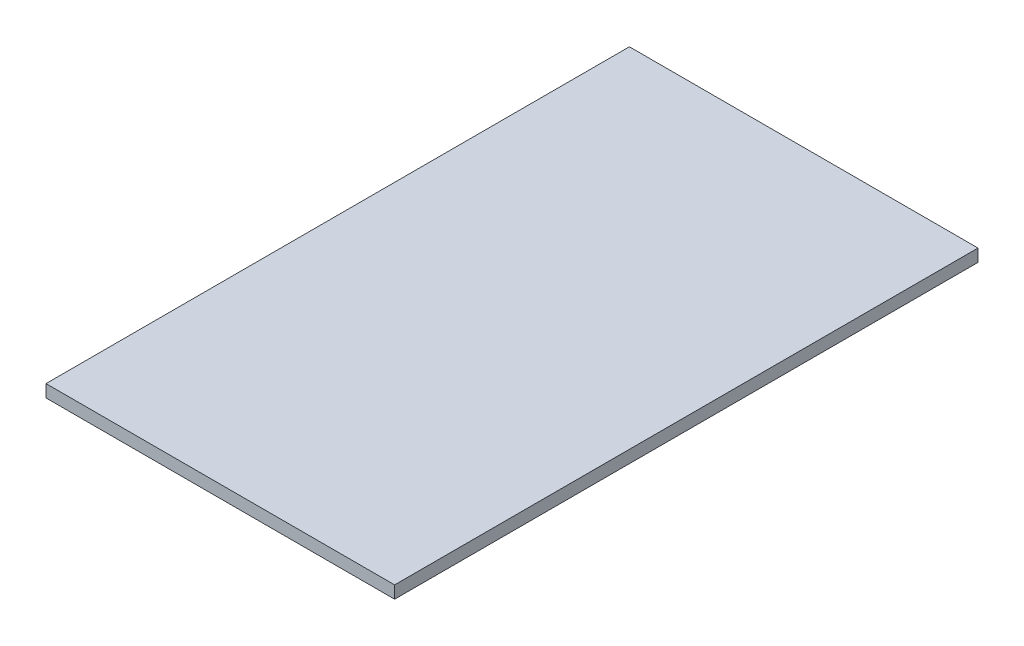
ISO-10303-21;
HEADER;
FILE_DESCRIPTION(('STEP AP214'),'2;1');
FILE_NAME('part.step','',(''),(''),'','','');
FILE_SCHEMA(('AUTOMOTIVE_DESIGN { 1 0 10303 214 1 1 1 1 }'));
ENDSEC;
DATA;
#1=APPLICATION_CONTEXT('core data for automotive mechanical design processes');
#2=APPLICATION_PROTOCOL_DEFINITION('international standard','automotive_design',2000,#1);
#3=PRODUCT_CONTEXT('',#1,'mechanical');
#4=PRODUCT('Part','Part','',(#3));
#5=PRODUCT_RELATED_PRODUCT_CATEGORY('part','',(#4));
#6=PRODUCT_DEFINITION_FORMATION('','',#4);
#7=PRODUCT_DEFINITION_CONTEXT('part definition',#1,'design');
#8=PRODUCT_DEFINITION('design','',#6,#7);
#9=PRODUCT_DEFINITION_SHAPE('','',#8);
#10=(LENGTH_UNIT() NAMED_UNIT(*) SI_UNIT(.MILLI.,.METRE.));
#11=(NAMED_UNIT(*) PLANE_ANGLE_UNIT() SI_UNIT($,.RADIAN.));
#12=(NAMED_UNIT(*) SI_UNIT($,.STERADIAN.) SOLID_ANGLE_UNIT());
#13=UNCERTAINTY_MEASURE_WITH_UNIT(LENGTH_MEASURE(1.E-05),#10,'distance_accuracy_value','');
#14=(GEOMETRIC_REPRESENTATION_CONTEXT(3) GLOBAL_UNCERTAINTY_ASSIGNED_CONTEXT((#13)) GLOBAL_UNIT_ASSIGNED_CONTEXT((#10,
#11,#12)) REPRESENTATION_CONTEXT('',''));
#15=CARTESIAN_POINT('',(0.,0.,0.));
#16=DIRECTION('',(0.,0.,1.));
#17=DIRECTION('',(1.,0.,0.));
#18=AXIS2_PLACEMENT_3D('',#15,#16,#17);
#19=CARTESIAN_POINT('',(49.,3.5,82.));
#20=DIRECTION('',(-1.,0.,0.));
#21=DIRECTION('',(0.,0.,1.));
#22=AXIS2_PLACEMENT_3D('',#19,#20,#21);
#23=PLANE('',#22);
#24=DIRECTION('',(0.,0.,-1.));
#25=VECTOR('',#24,1.);
#26=CARTESIAN_POINT('',(49.,0.,82.));
#27=LINE('',#26,#25);
#28=CARTESIAN_POINT('',(49.,0.,82.));
#29=VERTEX_POINT('',#28);
#30=CARTESIAN_POINT('',(49.,0.,-82.));
#31=VERTEX_POINT('',#30);
#32=EDGE_CURVE('E143',#29,#31,#27,.T.);
#33=ORIENTED_EDGE('',*,*,#32,.T.);
#34=DIRECTION('',(0.,-1.,0.));
#35=VECTOR('',#34,1.);
#36=CARTESIAN_POINT('',(49.,3.5,-82.));
#37=LINE('',#36,#35);
#38=CARTESIAN_POINT('',(49.,3.5,-82.));
#39=VERTEX_POINT('',#38);
#40=EDGE_CURVE('E11',#39,#31,#37,.T.);
#41=ORIENTED_EDGE('',*,*,#40,.F.);
#42=DIRECTION('',(0.,0.,-1.));
#43=VECTOR('',#42,1.);
#44=CARTESIAN_POINT('',(49.,3.5,82.));
#45=LINE('',#44,#43);
#46=CARTESIAN_POINT('',(49.,3.5,82.));
#47=VERTEX_POINT('',#46);
#48=EDGE_CURVE('E144',#47,#39,#45,.T.);
#49=ORIENTED_EDGE('',*,*,#48,.F.);
#50=DIRECTION('',(0.,-1.,0.));
#51=VECTOR('',#50,1.);
#52=CARTESIAN_POINT('',(49.,3.5,82.));
#53=LINE('',#52,#51);
#54=EDGE_CURVE('E157',#47,#29,#53,.T.);
#55=ORIENTED_EDGE('',*,*,#54,.T.);
#56=EDGE_LOOP('',(#33,#41,#49,#55));
#57=FACE_BOUND('',#56,.T.);
#58=ADVANCED_FACE('F39',(#57),#23,.F.);
#59=CARTESIAN_POINT('',(-49.,3.5,-82.));
#60=DIRECTION('',(0.,0.,1.));
#61=DIRECTION('',(1.,0.,0.));
#62=AXIS2_PLACEMENT_3D('',#59,#60,#61);
#63=PLANE('',#62);
#64=DIRECTION('',(-1.,0.,0.));
#65=VECTOR('',#64,1.);
#66=CARTESIAN_POINT('',(-49.,0.,-82.));
#67=LINE('',#66,#65);
#68=CARTESIAN_POINT('',(25.,0.,-82.));
#69=VERTEX_POINT('',#68);
#70=EDGE_CURVE('E161',#31,#69,#67,.T.);
#71=ORIENTED_EDGE('',*,*,#70,.T.);
#72=DIRECTION('',(0.,1.,0.));
#73=VECTOR('',#72,1.);
#74=CARTESIAN_POINT('',(25.,-5.,-82.));
#75=LINE('',#74,#73);
#76=CARTESIAN_POINT('',(25.,-5.,-82.));
#77=VERTEX_POINT('',#76);
#78=EDGE_CURVE('E112',#77,#69,#75,.T.);
#79=ORIENTED_EDGE('',*,*,#78,.F.);
#80=DIRECTION('',(1.,0.,0.));
#81=VECTOR('',#80,1.);
#82=CARTESIAN_POINT('',(-49.,-5.,-82.));
#83=LINE('',#82,#81);
#84=CARTESIAN_POINT('',(-49.,-5.,-82.));
#85=VERTEX_POINT('',#84);
#86=EDGE_CURVE('E109',#85,#77,#83,.T.);
#87=ORIENTED_EDGE('',*,*,#86,.F.);
#88=DIRECTION('',(0.,-1.,0.));
#89=VECTOR('',#88,1.);
#90=CARTESIAN_POINT('',(-49.,3.5,-82.));
#91=LINE('',#90,#89);
#92=CARTESIAN_POINT('',(-49.,3.5,-82.));
#93=VERTEX_POINT('',#92);
#94=EDGE_CURVE('E47',#93,#85,#91,.T.);
#95=ORIENTED_EDGE('',*,*,#94,.F.);
#96=DIRECTION('',(-1.,0.,0.));
#97=VECTOR('',#96,1.);
#98=CARTESIAN_POINT('',(-49.,3.5,-82.));
#99=LINE('',#98,#97);
#100=EDGE_CURVE('E148',#39,#93,#99,.T.);
#101=ORIENTED_EDGE('',*,*,#100,.F.);
#102=ORIENTED_EDGE('',*,*,#40,.T.);
#103=EDGE_LOOP('',(#71,#79,#87,#95,#101,#102));
#104=FACE_BOUND('',#103,.T.);
#105=ADVANCED_FACE('F110',(#104),#63,.F.);
#106=CARTESIAN_POINT('',(-49.,3.5,82.));
#107=DIRECTION('',(1.,0.,0.));
#108=DIRECTION('',(0.,0.,-1.));
#109=AXIS2_PLACEMENT_3D('',#106,#107,#108);
#110=PLANE('',#109);
#111=ORIENTED_EDGE('',*,*,#94,.T.);
#112=DIRECTION('',(0.,0.,-1.));
#113=VECTOR('',#112,1.);
#114=CARTESIAN_POINT('',(-49.,-5.,-82.));
#115=LINE('',#114,#113);
#116=CARTESIAN_POINT('',(-49.,-5.,-42.));
#117=VERTEX_POINT('',#116);
#118=EDGE_CURVE('E102',#117,#85,#115,.T.);
#119=ORIENTED_EDGE('',*,*,#118,.F.);
#120=DIRECTION('',(0.,1.,0.));
#121=VECTOR('',#120,1.);
#122=CARTESIAN_POINT('',(-49.,-5.,-42.));
#123=LINE('',#122,#121);
#124=CARTESIAN_POINT('',(-49.,0.,-42.));
#125=VERTEX_POINT('',#124);
#126=EDGE_CURVE('E132',#117,#125,#123,.T.);
#127=ORIENTED_EDGE('',*,*,#126,.T.);
#128=DIRECTION('',(0.,0.,1.));
#129=VECTOR('',#128,1.);
#130=CARTESIAN_POINT('',(-49.,0.,82.));
#131=LINE('',#130,#129);
#132=CARTESIAN_POINT('',(-49.,0.,82.));
#133=VERTEX_POINT('',#132);
#134=EDGE_CURVE('E60',#125,#133,#131,.T.);
#135=ORIENTED_EDGE('',*,*,#134,.T.);
#136=DIRECTION('',(0.,-1.,0.));
#137=VECTOR('',#136,1.);
#138=CARTESIAN_POINT('',(-49.,3.5,82.));
#139=LINE('',#138,#137);
#140=CARTESIAN_POINT('',(-49.,3.5,82.));
#141=VERTEX_POINT('',#140);
#142=EDGE_CURVE('E107',#141,#133,#139,.T.);
#143=ORIENTED_EDGE('',*,*,#142,.F.);
#144=DIRECTION('',(0.,0.,1.));
#145=VECTOR('',#144,1.);
#146=CARTESIAN_POINT('',(-49.,3.5,82.));
#147=LINE('',#146,#145);
#148=EDGE_CURVE('E104',#93,#141,#147,.T.);
#149=ORIENTED_EDGE('',*,*,#148,.F.);
#150=EDGE_LOOP('',(#111,#119,#127,#135,#143,#149));
#151=FACE_BOUND('',#150,.T.);
#152=ADVANCED_FACE('F99',(#151),#110,.F.);
#153=CARTESIAN_POINT('',(-49.,3.5,82.));
#154=DIRECTION('',(0.,0.,-1.));
#155=DIRECTION('',(-1.,0.,0.));
#156=AXIS2_PLACEMENT_3D('',#153,#154,#155);
#157=PLANE('',#156);
#158=DIRECTION('',(1.,0.,0.));
#159=VECTOR('',#158,1.);
#160=CARTESIAN_POINT('',(-49.,0.,82.));
#161=LINE('',#160,#159);
#162=EDGE_CURVE('E149',#133,#29,#161,.T.);
#163=ORIENTED_EDGE('',*,*,#162,.T.);
#164=ORIENTED_EDGE('',*,*,#54,.F.);
#165=DIRECTION('',(1.,0.,0.));
#166=VECTOR('',#165,1.);
#167=CARTESIAN_POINT('',(-49.,3.5,82.));
#168=LINE('',#167,#166);
#169=EDGE_CURVE('E154',#141,#47,#168,.T.);
#170=ORIENTED_EDGE('',*,*,#169,.F.);
#171=ORIENTED_EDGE('',*,*,#142,.T.);
#172=EDGE_LOOP('',(#163,#164,#170,#171));
#173=FACE_BOUND('',#172,.T.);
#174=ADVANCED_FACE('F175',(#173),#157,.F.);
#175=CARTESIAN_POINT('',(0.,3.5,0.));
#176=DIRECTION('',(0.,-1.,0.));
#177=DIRECTION('',(0.,0.,-1.));
#178=AXIS2_PLACEMENT_3D('',#175,#176,#177);
#179=PLANE('',#178);
#180=ORIENTED_EDGE('',*,*,#48,.T.);
#181=ORIENTED_EDGE('',*,*,#100,.T.);
#182=ORIENTED_EDGE('',*,*,#148,.T.);
#183=ORIENTED_EDGE('',*,*,#169,.T.);
#184=EDGE_LOOP('',(#180,#181,#182,#183));
#185=FACE_BOUND('',#184,.T.);
#186=ADVANCED_FACE('F183',(#185),#179,.F.);
#187=CARTESIAN_POINT('',(0.,0.,0.));
#188=DIRECTION('',(0.,-1.,0.));
#189=DIRECTION('',(0.,0.,-1.));
#190=AXIS2_PLACEMENT_3D('',#187,#188,#189);
#191=PLANE('',#190);
#192=DIRECTION('',(-1.,0.,0.));
#193=VECTOR('',#192,1.);
#194=CARTESIAN_POINT('',(-49.,0.,-42.));
#195=LINE('',#194,#193);
#196=CARTESIAN_POINT('',(25.,0.,-42.));
#197=VERTEX_POINT('',#196);
#198=EDGE_CURVE('E123',#197,#125,#195,.T.);
#199=ORIENTED_EDGE('',*,*,#198,.F.);
#200=DIRECTION('',(0.,0.,1.));
#201=VECTOR('',#200,1.);
#202=CARTESIAN_POINT('',(25.,0.,-82.));
#203=LINE('',#202,#201);
#204=EDGE_CURVE('E54',#69,#197,#203,.T.);
#205=ORIENTED_EDGE('',*,*,#204,.F.);
#206=ORIENTED_EDGE('',*,*,#70,.F.);
#207=ORIENTED_EDGE('',*,*,#32,.F.);
#208=ORIENTED_EDGE('',*,*,#162,.F.);
#209=ORIENTED_EDGE('',*,*,#134,.F.);
#210=EDGE_LOOP('',(#199,#205,#206,#207,#208,#209));
#211=FACE_BOUND('',#210,.T.);
#212=ADVANCED_FACE('F178',(#211),#191,.T.);
#213=CARTESIAN_POINT('',(25.,-5.,-82.));
#214=DIRECTION('',(-1.,0.,0.));
#215=DIRECTION('',(0.,0.,1.));
#216=AXIS2_PLACEMENT_3D('',#213,#214,#215);
#217=PLANE('',#216);
#218=ORIENTED_EDGE('',*,*,#204,.T.);
#219=DIRECTION('',(0.,1.,0.));
#220=VECTOR('',#219,1.);
#221=CARTESIAN_POINT('',(25.,-5.,-42.));
#222=LINE('',#221,#220);
#223=CARTESIAN_POINT('',(25.,-5.,-42.));
#224=VERTEX_POINT('',#223);
#225=EDGE_CURVE('E137',#224,#197,#222,.T.);
#226=ORIENTED_EDGE('',*,*,#225,.F.);
#227=DIRECTION('',(0.,0.,1.));
#228=VECTOR('',#227,1.);
#229=CARTESIAN_POINT('',(25.,-5.,-82.));
#230=LINE('',#229,#228);
#231=EDGE_CURVE('E116',#77,#224,#230,.T.);
#232=ORIENTED_EDGE('',*,*,#231,.F.);
#233=ORIENTED_EDGE('',*,*,#78,.T.);
#234=EDGE_LOOP('',(#218,#226,#232,#233));
#235=FACE_BOUND('',#234,.T.);
#236=ADVANCED_FACE('F185',(#235),#217,.F.);
#237=CARTESIAN_POINT('',(-49.,-5.,-42.));
#238=DIRECTION('',(0.,0.,-1.));
#239=DIRECTION('',(-1.,0.,0.));
#240=AXIS2_PLACEMENT_3D('',#237,#238,#239);
#241=PLANE('',#240);
#242=ORIENTED_EDGE('',*,*,#198,.T.);
#243=ORIENTED_EDGE('',*,*,#126,.F.);
#244=DIRECTION('',(-1.,0.,0.));
#245=VECTOR('',#244,1.);
#246=CARTESIAN_POINT('',(-49.,-5.,-42.));
#247=LINE('',#246,#245);
#248=EDGE_CURVE('E120',#224,#117,#247,.T.);
#249=ORIENTED_EDGE('',*,*,#248,.F.);
#250=ORIENTED_EDGE('',*,*,#225,.T.);
#251=EDGE_LOOP('',(#242,#243,#249,#250));
#252=FACE_BOUND('',#251,.T.);
#253=ADVANCED_FACE('F188',(#252),#241,.F.);
#254=CARTESIAN_POINT('',(0.,-5.,0.));
#255=DIRECTION('',(0.,1.,0.));
#256=DIRECTION('',(0.,0.,1.));
#257=AXIS2_PLACEMENT_3D('',#254,#255,#256);
#258=PLANE('',#257);
#259=ORIENTED_EDGE('',*,*,#118,.T.);
#260=ORIENTED_EDGE('',*,*,#86,.T.);
#261=ORIENTED_EDGE('',*,*,#231,.T.);
#262=ORIENTED_EDGE('',*,*,#248,.T.);
#263=EDGE_LOOP('',(#259,#260,#261,#262));
#264=FACE_BOUND('',#263,.T.);
#265=ADVANCED_FACE('F118',(#264),#258,.F.);
#266=CLOSED_SHELL('',(#58,#105,#152,#174,#186,#212,#236,#253,#265));
#267=MANIFOLD_SOLID_BREP('B2',#266);
#268=ADVANCED_BREP_SHAPE_REPRESENTATION('',(#18,#267),#14);
#269=SHAPE_DEFINITION_REPRESENTATION(#9,#268);
ENDSEC;
END-ISO-10303-21;
